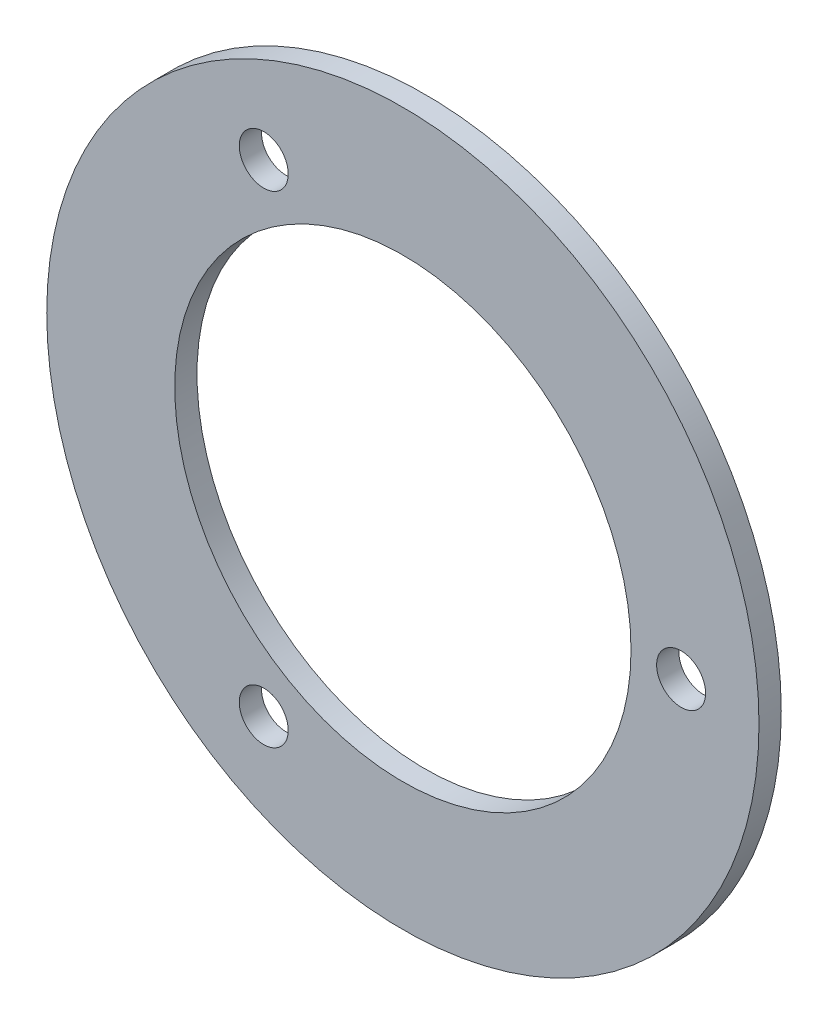
ISO-10303-21;
HEADER;
FILE_DESCRIPTION(('STEP AP214'),'2;1');
FILE_NAME('part.step','',(''),(''),'','','');
FILE_SCHEMA(('AUTOMOTIVE_DESIGN { 1 0 10303 214 1 1 1 1 }'));
ENDSEC;
DATA;
#1=APPLICATION_CONTEXT('core data for automotive mechanical design processes');
#2=APPLICATION_PROTOCOL_DEFINITION('international standard','automotive_design',2000,#1);
#3=PRODUCT_CONTEXT('',#1,'mechanical');
#4=PRODUCT('Part','Part','',(#3));
#5=PRODUCT_RELATED_PRODUCT_CATEGORY('part','',(#4));
#6=PRODUCT_DEFINITION_FORMATION('','',#4);
#7=PRODUCT_DEFINITION_CONTEXT('part definition',#1,'design');
#8=PRODUCT_DEFINITION('design','',#6,#7);
#9=PRODUCT_DEFINITION_SHAPE('','',#8);
#10=(LENGTH_UNIT() NAMED_UNIT(*) SI_UNIT(.MILLI.,.METRE.));
#11=(NAMED_UNIT(*) PLANE_ANGLE_UNIT() SI_UNIT($,.RADIAN.));
#12=(NAMED_UNIT(*) SI_UNIT($,.STERADIAN.) SOLID_ANGLE_UNIT());
#13=UNCERTAINTY_MEASURE_WITH_UNIT(LENGTH_MEASURE(1.E-05),#10,'distance_accuracy_value','');
#14=(GEOMETRIC_REPRESENTATION_CONTEXT(3) GLOBAL_UNCERTAINTY_ASSIGNED_CONTEXT((#13)) GLOBAL_UNIT_ASSIGNED_CONTEXT((#10,
#11,#12)) REPRESENTATION_CONTEXT('',''));
#15=CARTESIAN_POINT('',(0.,0.,0.));
#16=DIRECTION('',(0.,0.,1.));
#17=DIRECTION('',(1.,0.,0.));
#18=AXIS2_PLACEMENT_3D('',#15,#16,#17);
#19=CARTESIAN_POINT('',(0.,0.,1.));
#20=DIRECTION('',(0.,0.,1.));
#21=DIRECTION('',(1.,0.,0.));
#22=AXIS2_PLACEMENT_3D('',#19,#20,#21);
#23=PLANE('',#22);
#24=CARTESIAN_POINT('',(12.5,0.,1.));
#25=DIRECTION('',(0.,0.,1.));
#26=DIRECTION('',(1.,0.,0.));
#27=AXIS2_PLACEMENT_3D('',#24,#25,#26);
#28=CIRCLE('',#27,1.1);
#29=CARTESIAN_POINT('',(13.6,0.,1.));
#30=VERTEX_POINT('',#29);
#31=EDGE_CURVE('E52',#30,#30,#28,.T.);
#32=ORIENTED_EDGE('',*,*,#31,.F.);
#33=EDGE_LOOP('',(#32));
#34=FACE_BOUND('',#33,.T.);
#35=CARTESIAN_POINT('',(-6.25,10.8253175473055,1.));
#36=DIRECTION('',(0.,0.,1.));
#37=DIRECTION('',(1.,0.,0.));
#38=AXIS2_PLACEMENT_3D('',#35,#36,#37);
#39=CIRCLE('',#38,1.1);
#40=CARTESIAN_POINT('',(-5.15,10.8253175473055,1.));
#41=VERTEX_POINT('',#40);
#42=EDGE_CURVE('E59',#41,#41,#39,.T.);
#43=ORIENTED_EDGE('',*,*,#42,.F.);
#44=EDGE_LOOP('',(#43));
#45=FACE_BOUND('',#44,.T.);
#46=CARTESIAN_POINT('',(-6.25000000000001,-10.8253175473055,1.));
#47=DIRECTION('',(0.,0.,1.));
#48=DIRECTION('',(1.,0.,0.));
#49=AXIS2_PLACEMENT_3D('',#46,#47,#48);
#50=CIRCLE('',#49,1.1);
#51=CARTESIAN_POINT('',(-5.15000000000001,-10.8253175473055,1.));
#52=VERTEX_POINT('',#51);
#53=EDGE_CURVE('E62',#52,#52,#50,.T.);
#54=ORIENTED_EDGE('',*,*,#53,.F.);
#55=EDGE_LOOP('',(#54));
#56=FACE_BOUND('',#55,.T.);
#57=CARTESIAN_POINT('',(0.,0.,1.));
#58=DIRECTION('',(0.,0.,1.));
#59=DIRECTION('',(1.,0.,0.));
#60=AXIS2_PLACEMENT_3D('',#57,#58,#59);
#61=CIRCLE('',#60,16.);
#62=CARTESIAN_POINT('',(16.,0.,1.));
#63=VERTEX_POINT('',#62);
#64=EDGE_CURVE('E10',#63,#63,#61,.T.);
#65=ORIENTED_EDGE('',*,*,#64,.T.);
#66=EDGE_LOOP('',(#65));
#67=FACE_BOUND('',#66,.T.);
#68=CARTESIAN_POINT('',(0.,0.,1.));
#69=DIRECTION('',(0.,0.,1.));
#70=DIRECTION('',(1.,0.,0.));
#71=AXIS2_PLACEMENT_3D('',#68,#69,#70);
#72=CIRCLE('',#71,10.25);
#73=CARTESIAN_POINT('',(10.25,0.,1.));
#74=VERTEX_POINT('',#73);
#75=EDGE_CURVE('E48',#74,#74,#72,.T.);
#76=ORIENTED_EDGE('',*,*,#75,.F.);
#77=EDGE_LOOP('',(#76));
#78=FACE_BOUND('',#77,.T.);
#79=ADVANCED_FACE('F40',(#34,#45,#56,#67,#78),#23,.T.);
#80=CARTESIAN_POINT('',(0.,0.,0.));
#81=DIRECTION('',(0.,0.,1.));
#82=DIRECTION('',(1.,0.,0.));
#83=AXIS2_PLACEMENT_3D('',#80,#81,#82);
#84=PLANE('',#83);
#85=CARTESIAN_POINT('',(12.5,0.,0.));
#86=DIRECTION('',(0.,0.,-1.));
#87=DIRECTION('',(-1.,0.,0.));
#88=AXIS2_PLACEMENT_3D('',#85,#86,#87);
#89=CIRCLE('',#88,1.1);
#90=CARTESIAN_POINT('',(11.4,0.,0.));
#91=VERTEX_POINT('',#90);
#92=EDGE_CURVE('E61',#91,#91,#89,.T.);
#93=ORIENTED_EDGE('',*,*,#92,.F.);
#94=EDGE_LOOP('',(#93));
#95=FACE_BOUND('',#94,.T.);
#96=CARTESIAN_POINT('',(-6.25,10.8253175473055,0.));
#97=DIRECTION('',(0.,0.,-1.));
#98=DIRECTION('',(-1.,0.,0.));
#99=AXIS2_PLACEMENT_3D('',#96,#97,#98);
#100=CIRCLE('',#99,1.1);
#101=CARTESIAN_POINT('',(-7.35,10.8253175473055,0.));
#102=VERTEX_POINT('',#101);
#103=EDGE_CURVE('E68',#102,#102,#100,.T.);
#104=ORIENTED_EDGE('',*,*,#103,.F.);
#105=EDGE_LOOP('',(#104));
#106=FACE_BOUND('',#105,.T.);
#107=CARTESIAN_POINT('',(-6.25000000000001,-10.8253175473055,0.));
#108=DIRECTION('',(0.,0.,-1.));
#109=DIRECTION('',(-1.,0.,0.));
#110=AXIS2_PLACEMENT_3D('',#107,#108,#109);
#111=CIRCLE('',#110,1.1);
#112=CARTESIAN_POINT('',(-7.35000000000001,-10.8253175473055,0.));
#113=VERTEX_POINT('',#112);
#114=EDGE_CURVE('E63',#113,#113,#111,.T.);
#115=ORIENTED_EDGE('',*,*,#114,.F.);
#116=EDGE_LOOP('',(#115));
#117=FACE_BOUND('',#116,.T.);
#118=CARTESIAN_POINT('',(0.,0.,0.));
#119=DIRECTION('',(0.,0.,1.));
#120=DIRECTION('',(1.,0.,0.));
#121=AXIS2_PLACEMENT_3D('',#118,#119,#120);
#122=CIRCLE('',#121,16.);
#123=CARTESIAN_POINT('',(16.,0.,0.));
#124=VERTEX_POINT('',#123);
#125=EDGE_CURVE('E41',#124,#124,#122,.T.);
#126=ORIENTED_EDGE('',*,*,#125,.F.);
#127=EDGE_LOOP('',(#126));
#128=FACE_BOUND('',#127,.T.);
#129=CARTESIAN_POINT('',(0.,0.,0.));
#130=DIRECTION('',(0.,0.,1.));
#131=DIRECTION('',(1.,0.,0.));
#132=AXIS2_PLACEMENT_3D('',#129,#130,#131);
#133=CIRCLE('',#132,10.25);
#134=CARTESIAN_POINT('',(10.25,0.,0.));
#135=VERTEX_POINT('',#134);
#136=EDGE_CURVE('E49',#135,#135,#133,.T.);
#137=ORIENTED_EDGE('',*,*,#136,.T.);
#138=EDGE_LOOP('',(#137));
#139=FACE_BOUND('',#138,.T.);
#140=ADVANCED_FACE('F77',(#95,#106,#117,#128,#139),#84,.F.);
#141=CARTESIAN_POINT('',(0.,0.,1.));
#142=DIRECTION('',(0.,0.,-1.));
#143=DIRECTION('',(-1.,0.,0.));
#144=AXIS2_PLACEMENT_3D('',#141,#142,#143);
#145=CYLINDRICAL_SURFACE('',#144,16.);
#146=ORIENTED_EDGE('',*,*,#64,.F.);
#147=EDGE_LOOP('',(#146));
#148=FACE_BOUND('',#147,.T.);
#149=ORIENTED_EDGE('',*,*,#125,.T.);
#150=EDGE_LOOP('',(#149));
#151=FACE_BOUND('',#150,.T.);
#152=ADVANCED_FACE('F39',(#148,#151),#145,.T.);
#153=CARTESIAN_POINT('',(0.,0.,1.));
#154=DIRECTION('',(0.,0.,-1.));
#155=DIRECTION('',(-1.,0.,0.));
#156=AXIS2_PLACEMENT_3D('',#153,#154,#155);
#157=CYLINDRICAL_SURFACE('',#156,10.25);
#158=ORIENTED_EDGE('',*,*,#75,.T.);
#159=EDGE_LOOP('',(#158));
#160=FACE_BOUND('',#159,.T.);
#161=ORIENTED_EDGE('',*,*,#136,.F.);
#162=EDGE_LOOP('',(#161));
#163=FACE_BOUND('',#162,.T.);
#164=ADVANCED_FACE('F90',(#160,#163),#157,.F.);
#165=CARTESIAN_POINT('',(-6.25000000000001,-10.8253175473055,1.01));
#166=DIRECTION('',(0.,0.,-1.));
#167=DIRECTION('',(-1.,0.,0.));
#168=AXIS2_PLACEMENT_3D('',#165,#166,#167);
#169=CYLINDRICAL_SURFACE('',#168,1.1);
#170=ORIENTED_EDGE('',*,*,#53,.T.);
#171=EDGE_LOOP('',(#170));
#172=FACE_BOUND('',#171,.T.);
#173=ORIENTED_EDGE('',*,*,#114,.T.);
#174=EDGE_LOOP('',(#173));
#175=FACE_BOUND('',#174,.T.);
#176=ADVANCED_FACE('F86',(#172,#175),#169,.F.);
#177=CARTESIAN_POINT('',(-6.25,10.8253175473055,1.01));
#178=DIRECTION('',(0.,0.,-1.));
#179=DIRECTION('',(-1.,0.,0.));
#180=AXIS2_PLACEMENT_3D('',#177,#178,#179);
#181=CYLINDRICAL_SURFACE('',#180,1.1);
#182=ORIENTED_EDGE('',*,*,#42,.T.);
#183=EDGE_LOOP('',(#182));
#184=FACE_BOUND('',#183,.T.);
#185=ORIENTED_EDGE('',*,*,#103,.T.);
#186=EDGE_LOOP('',(#185));
#187=FACE_BOUND('',#186,.T.);
#188=ADVANCED_FACE('F100',(#184,#187),#181,.F.);
#189=CARTESIAN_POINT('',(12.5,0.,1.01));
#190=DIRECTION('',(0.,0.,-1.));
#191=DIRECTION('',(-1.,0.,0.));
#192=AXIS2_PLACEMENT_3D('',#189,#190,#191);
#193=CYLINDRICAL_SURFACE('',#192,1.1);
#194=ORIENTED_EDGE('',*,*,#31,.T.);
#195=EDGE_LOOP('',(#194));
#196=FACE_BOUND('',#195,.T.);
#197=ORIENTED_EDGE('',*,*,#92,.T.);
#198=EDGE_LOOP('',(#197));
#199=FACE_BOUND('',#198,.T.);
#200=ADVANCED_FACE('F73',(#196,#199),#193,.F.);
#201=CLOSED_SHELL('',(#79,#140,#152,#164,#176,#188,#200));
#202=MANIFOLD_SOLID_BREP('B2',#201);
#203=ADVANCED_BREP_SHAPE_REPRESENTATION('',(#18,#202),#14);
#204=SHAPE_DEFINITION_REPRESENTATION(#9,#203);
ENDSEC;
END-ISO-10303-21;
